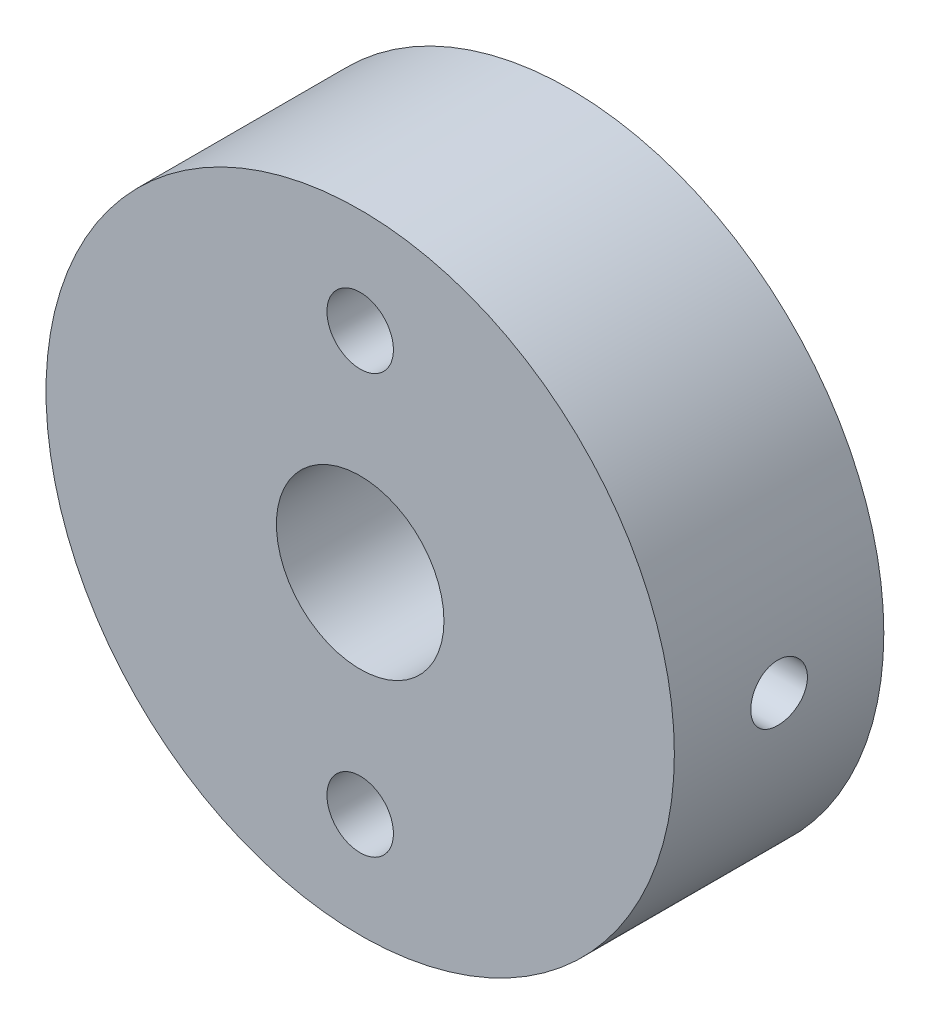
ISO-10303-21;
HEADER;
FILE_DESCRIPTION(('STEP AP214'),'2;1');
FILE_NAME('part.step','',(''),(''),'','','');
FILE_SCHEMA(('AUTOMOTIVE_DESIGN { 1 0 10303 214 1 1 1 1 }'));
ENDSEC;
DATA;
#1=APPLICATION_CONTEXT('core data for automotive mechanical design processes');
#2=APPLICATION_PROTOCOL_DEFINITION('international standard','automotive_design',2000,#1);
#3=PRODUCT_CONTEXT('',#1,'mechanical');
#4=PRODUCT('Part','Part','',(#3));
#5=PRODUCT_RELATED_PRODUCT_CATEGORY('part','',(#4));
#6=PRODUCT_DEFINITION_FORMATION('','',#4);
#7=PRODUCT_DEFINITION_CONTEXT('part definition',#1,'design');
#8=PRODUCT_DEFINITION('design','',#6,#7);
#9=PRODUCT_DEFINITION_SHAPE('','',#8);
#10=(LENGTH_UNIT() NAMED_UNIT(*) SI_UNIT(.MILLI.,.METRE.));
#11=(NAMED_UNIT(*) PLANE_ANGLE_UNIT() SI_UNIT($,.RADIAN.));
#12=(NAMED_UNIT(*) SI_UNIT($,.STERADIAN.) SOLID_ANGLE_UNIT());
#13=UNCERTAINTY_MEASURE_WITH_UNIT(LENGTH_MEASURE(1.E-05),#10,'distance_accuracy_value','');
#14=(GEOMETRIC_REPRESENTATION_CONTEXT(3) GLOBAL_UNCERTAINTY_ASSIGNED_CONTEXT((#13)) GLOBAL_UNIT_ASSIGNED_CONTEXT((#10,
#11,#12)) REPRESENTATION_CONTEXT('',''));
#15=CARTESIAN_POINT('',(0.,0.,0.));
#16=DIRECTION('',(0.,0.,1.));
#17=DIRECTION('',(1.,0.,0.));
#18=AXIS2_PLACEMENT_3D('',#15,#16,#17);
#19=CARTESIAN_POINT('',(0.,0.,10.));
#20=DIRECTION('',(0.,0.,1.));
#21=DIRECTION('',(1.,0.,0.));
#22=AXIS2_PLACEMENT_3D('',#19,#20,#21);
#23=PLANE('',#22);
#24=CARTESIAN_POINT('',(0.,0.,10.));
#25=DIRECTION('',(0.,0.,1.));
#26=DIRECTION('',(1.,0.,0.));
#27=AXIS2_PLACEMENT_3D('',#24,#25,#26);
#28=CIRCLE('',#27,4.);
#29=CARTESIAN_POINT('',(4.,0.,10.));
#30=VERTEX_POINT('',#29);
#31=EDGE_CURVE('E52',#30,#30,#28,.T.);
#32=ORIENTED_EDGE('',*,*,#31,.F.);
#33=EDGE_LOOP('',(#32));
#34=FACE_BOUND('',#33,.T.);
#35=CARTESIAN_POINT('',(0.,0.,10.));
#36=DIRECTION('',(0.,0.,1.));
#37=DIRECTION('',(1.,0.,0.));
#38=AXIS2_PLACEMENT_3D('',#35,#36,#37);
#39=CIRCLE('',#38,15.);
#40=CARTESIAN_POINT('',(15.,0.,10.));
#41=VERTEX_POINT('',#40);
#42=EDGE_CURVE('E10',#41,#41,#39,.T.);
#43=ORIENTED_EDGE('',*,*,#42,.T.);
#44=EDGE_LOOP('',(#43));
#45=FACE_BOUND('',#44,.T.);
#46=CARTESIAN_POINT('',(0.,10.,10.));
#47=DIRECTION('',(0.,0.,1.));
#48=DIRECTION('',(1.,0.,0.));
#49=AXIS2_PLACEMENT_3D('',#46,#47,#48);
#50=CIRCLE('',#49,1.5875);
#51=CARTESIAN_POINT('',(1.5875,10.,10.));
#52=VERTEX_POINT('',#51);
#53=EDGE_CURVE('E47',#52,#52,#50,.T.);
#54=ORIENTED_EDGE('',*,*,#53,.F.);
#55=EDGE_LOOP('',(#54));
#56=FACE_BOUND('',#55,.T.);
#57=CARTESIAN_POINT('',(2.8176792204172E-13,-10.,10.));
#58=DIRECTION('',(0.,0.,1.));
#59=DIRECTION('',(1.,0.,0.));
#60=AXIS2_PLACEMENT_3D('',#57,#58,#59);
#61=CIRCLE('',#60,1.5875);
#62=CARTESIAN_POINT('',(1.58750000000028,-10.,10.));
#63=VERTEX_POINT('',#62);
#64=EDGE_CURVE('E58',#63,#63,#61,.T.);
#65=ORIENTED_EDGE('',*,*,#64,.F.);
#66=EDGE_LOOP('',(#65));
#67=FACE_BOUND('',#66,.T.);
#68=ADVANCED_FACE('F35',(#34,#45,#56,#67),#23,.T.);
#69=CARTESIAN_POINT('',(0.,0.,0.));
#70=DIRECTION('',(0.,0.,1.));
#71=DIRECTION('',(1.,0.,0.));
#72=AXIS2_PLACEMENT_3D('',#69,#70,#71);
#73=PLANE('',#72);
#74=CARTESIAN_POINT('',(0.,0.,0.));
#75=DIRECTION('',(0.,0.,1.));
#76=DIRECTION('',(1.,0.,0.));
#77=AXIS2_PLACEMENT_3D('',#74,#75,#76);
#78=CIRCLE('',#77,4.);
#79=CARTESIAN_POINT('',(4.,0.,0.));
#80=VERTEX_POINT('',#79);
#81=EDGE_CURVE('E55',#80,#80,#78,.T.);
#82=ORIENTED_EDGE('',*,*,#81,.T.);
#83=EDGE_LOOP('',(#82));
#84=FACE_BOUND('',#83,.T.);
#85=CARTESIAN_POINT('',(0.,0.,0.));
#86=DIRECTION('',(0.,0.,1.));
#87=DIRECTION('',(1.,0.,0.));
#88=AXIS2_PLACEMENT_3D('',#85,#86,#87);
#89=CIRCLE('',#88,15.);
#90=CARTESIAN_POINT('',(15.,0.,0.));
#91=VERTEX_POINT('',#90);
#92=EDGE_CURVE('E40',#91,#91,#89,.T.);
#93=ORIENTED_EDGE('',*,*,#92,.F.);
#94=EDGE_LOOP('',(#93));
#95=FACE_BOUND('',#94,.T.);
#96=CARTESIAN_POINT('',(0.,10.,0.));
#97=DIRECTION('',(0.,0.,1.));
#98=DIRECTION('',(1.,0.,0.));
#99=AXIS2_PLACEMENT_3D('',#96,#97,#98);
#100=CIRCLE('',#99,1.5875);
#101=CARTESIAN_POINT('',(1.5875,10.,0.));
#102=VERTEX_POINT('',#101);
#103=EDGE_CURVE('E49',#102,#102,#100,.T.);
#104=ORIENTED_EDGE('',*,*,#103,.T.);
#105=EDGE_LOOP('',(#104));
#106=FACE_BOUND('',#105,.T.);
#107=CARTESIAN_POINT('',(2.8176792204172E-13,-10.,0.));
#108=DIRECTION('',(0.,0.,1.));
#109=DIRECTION('',(1.,0.,0.));
#110=AXIS2_PLACEMENT_3D('',#107,#108,#109);
#111=CIRCLE('',#110,1.5875);
#112=CARTESIAN_POINT('',(1.58750000000028,-10.,0.));
#113=VERTEX_POINT('',#112);
#114=EDGE_CURVE('E61',#113,#113,#111,.T.);
#115=ORIENTED_EDGE('',*,*,#114,.T.);
#116=EDGE_LOOP('',(#115));
#117=FACE_BOUND('',#116,.T.);
#118=ADVANCED_FACE('F96',(#84,#95,#106,#117),#73,.F.);
#119=CARTESIAN_POINT('',(0.,0.,10.));
#120=DIRECTION('',(0.,0.,-1.));
#121=DIRECTION('',(-1.,0.,0.));
#122=AXIS2_PLACEMENT_3D('',#119,#120,#121);
#123=CYLINDRICAL_SURFACE('',#122,15.);
#124=CARTESIAN_POINT('',(15.,0.,3.64744990600001));
#125=CARTESIAN_POINT('',(14.9999992058665,-0.0758081580350931,3.64745320656522));
#126=CARTESIAN_POINT('',(14.9994191935841,-0.151667346377626,3.65384473204097));
#127=CARTESIAN_POINT('',(14.9971611785516,-0.30128520529845,3.6792467544564));
#128=CARTESIAN_POINT('',(14.9954819451863,-0.375041424840312,3.69827139493923));
#129=CARTESIAN_POINT('',(14.9912151695011,-0.518264879092154,3.74838357901847));
#130=CARTESIAN_POINT('',(14.9886281546888,-0.58773457717212,3.77946411809135));
#131=CARTESIAN_POINT('',(14.9828356068879,-0.720455006174018,3.85279288190146));
#132=CARTESIAN_POINT('',(14.9796302026163,-0.78370702716848,3.8950387832591));
#133=CARTESIAN_POINT('',(14.9729497226736,-0.902399694196763,3.98963359026781));
#134=CARTESIAN_POINT('',(14.9694739611822,-0.957819398879537,4.04200872598811));
#135=CARTESIAN_POINT('',(14.9626502282661,-1.05909446005798,4.15531959745669));
#136=CARTESIAN_POINT('',(14.9593022625735,-1.10494938794216,4.21625571663033));
#137=CARTESIAN_POINT('',(14.9531059811379,-1.1858655517647,4.3450874517813));
#138=CARTESIAN_POINT('',(14.9502585318359,-1.22090814820215,4.41299482003091));
#139=CARTESIAN_POINT('',(14.9453938257374,-1.27908587619743,4.55375967357761));
#140=CARTESIAN_POINT('',(14.9433765520164,-1.30222125050697,4.62661705792479));
#141=CARTESIAN_POINT('',(14.9404065602561,-1.33586648196565,4.77500229873164));
#142=CARTESIAN_POINT('',(14.9394509429918,-1.34641072953017,4.85052229843473));
#143=CARTESIAN_POINT('',(14.9387033725099,-1.35468066282716,5.00226576083181));
#144=CARTESIAN_POINT('',(14.9389113940625,-1.35240662648491,5.0784892082379));
#145=CARTESIAN_POINT('',(14.9404649568342,-1.33513293477152,5.22923964893356));
#146=CARTESIAN_POINT('',(14.9418071510828,-1.32017072205085,5.30377097190119));
#147=CARTESIAN_POINT('',(14.9454725874951,-1.2780036055167,5.44926016320109));
#148=CARTESIAN_POINT('',(14.9477958406719,-1.25079856426956,5.52021799140864));
#149=CARTESIAN_POINT('',(14.9531654766319,-1.18487634987832,5.65666487981866));
#150=CARTESIAN_POINT('',(14.9562129087597,-1.14614245051006,5.72214581603185));
#151=CARTESIAN_POINT('',(14.9626865995185,-1.05827407509715,5.8456912935356));
#152=CARTESIAN_POINT('',(14.9661128671487,-1.00913935195625,5.90375565857535));
#153=CARTESIAN_POINT('',(14.9729730766611,-0.901654419402946,6.0110374179021));
#154=CARTESIAN_POINT('',(14.9764070021142,-0.843271853237719,6.06022240103862));
#155=CARTESIAN_POINT('',(14.982883969099,-0.71906117938359,6.14809838065316));
#156=CARTESIAN_POINT('',(14.985927010307,-0.653233065528459,6.18678936844021));
#157=CARTESIAN_POINT('',(14.9912800771272,-0.515978307885073,6.25257732337302));
#158=CARTESIAN_POINT('',(14.9935900068424,-0.44455093319138,6.27967277389128));
#159=CARTESIAN_POINT('',(14.9972155383322,-0.29813524039691,6.32147741007426));
#160=CARTESIAN_POINT('',(14.9985311642719,-0.223147008885091,6.33618689676432));
#161=CARTESIAN_POINT('',(15.0000167515703,-0.0720190787729175,6.35276123399728));
#162=CARTESIAN_POINT('',(15.0001907044379,0.00411567433265238,6.35467083590254));
#163=CARTESIAN_POINT('',(14.9993840229679,0.155622157180234,6.34570854852532));
#164=CARTESIAN_POINT('',(14.9984034012697,0.230993895266114,6.33483679916454));
#165=CARTESIAN_POINT('',(14.9954003804241,0.378706612533805,6.3006575235702));
#166=CARTESIAN_POINT('',(14.9933797260214,0.451052448838974,6.27737082215504));
#167=CARTESIAN_POINT('',(14.988523512928,0.590810388433427,6.2190439870601));
#168=CARTESIAN_POINT('',(14.985687939239,0.658222400887899,6.18400363705452));
#169=CARTESIAN_POINT('',(14.9795095348584,0.786402257087437,6.10305228504276));
#170=CARTESIAN_POINT('',(14.9761653342114,0.847151370315507,6.05711173099408));
#171=CARTESIAN_POINT('',(14.9693497300832,0.960091706233924,5.95570662033652));
#172=CARTESIAN_POINT('',(14.9658783240137,1.01228275468397,5.90024186986417));
#173=CARTESIAN_POINT('',(14.9591876648378,1.10677968445096,5.78116819449133));
#174=CARTESIAN_POINT('',(14.9559691765143,1.14905629731429,5.71753599316432));
#175=CARTESIAN_POINT('',(14.9501599339076,1.22232339334472,5.58404914939775));
#176=CARTESIAN_POINT('',(14.9475691724464,1.25331400557059,5.51419457812421));
#177=CARTESIAN_POINT('',(14.9433132226975,1.30307986628873,5.37034827666375));
#178=CARTESIAN_POINT('',(14.9416466921495,1.3218728362121,5.29636271882573));
#179=CARTESIAN_POINT('',(14.9394235427809,1.34676757146813,5.14627055836846));
#180=CARTESIAN_POINT('',(14.9388668985823,1.35286962698579,5.07016400428733));
#181=CARTESIAN_POINT('',(14.9389269863503,1.35220570872011,4.91828111268282));
#182=CARTESIAN_POINT('',(14.9395395254148,1.34548571714396,4.84250456827683));
#183=CARTESIAN_POINT('',(14.9418600417013,1.31946454860505,4.69316121408006));
#184=CARTESIAN_POINT('',(14.9435680204383,1.30016335424364,4.61959440734528));
#185=CARTESIAN_POINT('',(14.9478858444146,1.24953973556081,4.47675715237553));
#186=CARTESIAN_POINT('',(14.9504956118149,1.21821834875196,4.40748633393526));
#187=CARTESIAN_POINT('',(14.9563231062548,1.14444840170881,4.27517835127851));
#188=CARTESIAN_POINT('',(14.9595408261471,1.10199997228702,4.21214111379036));
#189=CARTESIAN_POINT('',(14.9662354429999,1.00700801061017,4.09385415067731));
#190=CARTESIAN_POINT('',(14.9697131918964,0.954430317861148,4.03863190609529));
#191=CARTESIAN_POINT('',(14.9765282124078,0.840737014700298,3.93777203270307));
#192=CARTESIAN_POINT('',(14.9798654499668,0.7796193497791,3.89213671690792));
#193=CARTESIAN_POINT('',(14.986030485119,0.650443870388163,3.81167381028577));
#194=CARTESIAN_POINT('',(14.9888571914165,0.582371664910512,3.77686925885965));
#195=CARTESIAN_POINT('',(14.9936702974211,0.44136923458162,3.71922947632665));
#196=CARTESIAN_POINT('',(14.9956576553888,0.368444660297001,3.69638058860965));
#197=CARTESIAN_POINT('',(14.9980621495304,0.245913751058619,3.66907275107043));
#198=CARTESIAN_POINT('',(14.9987855041192,0.197093662118762,3.66097507805234));
#199=CARTESIAN_POINT('',(14.9997546875403,0.0988562821065964,3.6501625878879));
#200=CARTESIAN_POINT('',(15.0000005179015,0.0494389929470205,3.64744775350581));
#201=CARTESIAN_POINT('',(15.,0.,3.64744990600001));
#202=B_SPLINE_CURVE_WITH_KNOTS('',3,(#124,#125,#126,#127,#128,#129,#130,#131,#132,#133,#134,
#135,#136,#137,#138,#139,#140,#141,#142,#143,#144,#145,#146,#147,#148,#149,#150,#151,#152,#153,
#154,#155,#156,#157,#158,#159,#160,#161,#162,#163,#164,#165,#166,#167,#168,#169,#170,#171,#172,
#173,#174,#175,#176,#177,#178,#179,#180,#181,#182,#183,#184,#185,#186,#187,#188,#189,#190,#191,
#192,#193,#194,#195,#196,#197,#198,#199,#200,#201),.UNSPECIFIED.,.T.,.F.,(4,2,2,2,2,2,2,2,2,2,2,
2,2,2,2,2,2,2,2,2,2,2,2,2,2,2,2,2,2,2,2,2,2,2,2,2,2,2,4),(0.,0.22724395762551,0.454742758634511,
0.68210957946888,0.909429125161569,1.13734540268933,1.36527189128214,1.59358913746592,
1.82190172877776,2.04958928813136,2.2772719107954,2.50428497363473,2.73130058490595,
2.95864717237611,3.18599916161015,3.41416494380003,3.64233091495288,3.87052671974744,
4.09871697836884,4.32610901295139,4.55349855822086,4.78050787523338,5.00752137058006,
5.23515751057122,5.4627982846084,5.69110284848253,5.919404801544,6.14737431759619,
6.37533862093811,6.60248693884002,6.82963557086786,7.0567646011646,7.28389096139102,
7.51179714560285,7.73975825319662,7.96820102037277,8.19638227115084,8.3445819990298,
8.49278125237532),.UNSPECIFIED.);
#203=CARTESIAN_POINT('',(15.,0.,3.64744990600001));
#204=VERTEX_POINT('',#203);
#205=EDGE_CURVE('E64',#204,#204,#202,.T.);
#206=ORIENTED_EDGE('',*,*,#205,.T.);
#207=EDGE_LOOP('',(#206));
#208=FACE_BOUND('',#207,.T.);
#209=ORIENTED_EDGE('',*,*,#42,.F.);
#210=EDGE_LOOP('',(#209));
#211=FACE_BOUND('',#210,.T.);
#212=ORIENTED_EDGE('',*,*,#92,.T.);
#213=EDGE_LOOP('',(#212));
#214=FACE_BOUND('',#213,.T.);
#215=ADVANCED_FACE('F37',(#208,#211,#214),#123,.T.);
#216=CARTESIAN_POINT('',(0.,10.,10.));
#217=DIRECTION('',(0.,0.,-1.));
#218=DIRECTION('',(-1.,0.,0.));
#219=AXIS2_PLACEMENT_3D('',#216,#217,#218);
#220=CYLINDRICAL_SURFACE('',#219,1.5875);
#221=ORIENTED_EDGE('',*,*,#53,.T.);
#222=EDGE_LOOP('',(#221));
#223=FACE_BOUND('',#222,.T.);
#224=ORIENTED_EDGE('',*,*,#103,.F.);
#225=EDGE_LOOP('',(#224));
#226=FACE_BOUND('',#225,.T.);
#227=ADVANCED_FACE('F90',(#223,#226),#220,.F.);
#228=CARTESIAN_POINT('',(0.,0.,10.));
#229=DIRECTION('',(0.,0.,-1.));
#230=DIRECTION('',(-1.,0.,0.));
#231=AXIS2_PLACEMENT_3D('',#228,#229,#230);
#232=CYLINDRICAL_SURFACE('',#231,4.);
#233=CARTESIAN_POINT('',(4.,0.,3.64744990600001));
#234=CARTESIAN_POINT('',(4.0000003652744,-0.0737390509618185,3.64744934594));
#235=CARTESIAN_POINT('',(3.9979422676283,-0.147474310927838,3.6534996681396));
#236=CARTESIAN_POINT('',(3.98993514213324,-0.292769357385459,3.67746445232306));
#237=CARTESIAN_POINT('',(3.98398582152813,-0.364328979769023,3.69537980697392));
#238=CARTESIAN_POINT('',(3.96884184238156,-0.503157126306702,3.74238779972289));
#239=CARTESIAN_POINT('',(3.95965270522232,-0.570432722546803,3.77146142900934));
#240=CARTESIAN_POINT('',(3.93896448953899,-0.699152411861926,3.83987356813319));
#241=CARTESIAN_POINT('',(3.92746493502911,-0.760595299451358,3.87921419364883));
#242=CARTESIAN_POINT('',(3.90290684204576,-0.878087591662698,3.96851012490239));
#243=CARTESIAN_POINT('',(3.88981017965103,-0.933901351542575,4.01876493346578));
#244=CARTESIAN_POINT('',(3.86374115173317,-1.03648991777588,4.127826057846));
#245=CARTESIAN_POINT('',(3.85076881530033,-1.08326265549071,4.18663432536275));
#246=CARTESIAN_POINT('',(3.82599515792021,-1.16780306583327,4.31327416986333));
#247=CARTESIAN_POINT('',(3.81424014143166,-1.20526152944493,4.38132209984905));
#248=CARTESIAN_POINT('',(3.793813224202,-1.2681013612762,4.52321341614728));
#249=CARTESIAN_POINT('',(3.78514035154269,-1.29348653752227,4.59705496652644));
#250=CARTESIAN_POINT('',(3.77226179997908,-1.33057003933591,4.74575355187506));
#251=CARTESIAN_POINT('',(3.76791214685452,-1.34271089853046,4.82048737993321));
#252=CARTESIAN_POINT('',(3.76374712025534,-1.35434465925974,4.97104821284548));
#253=CARTESIAN_POINT('',(3.76393029707729,-1.35384160460854,5.04687486043691));
#254=CARTESIAN_POINT('',(3.76868428428414,-1.34054483005336,5.1936661448558));
#255=CARTESIAN_POINT('',(3.77304757543275,-1.32833239185101,5.26469133121487));
#256=CARTESIAN_POINT('',(3.78533000773349,-1.29291317512871,5.40361805577399));
#257=CARTESIAN_POINT('',(3.79324958622069,-1.26970504439218,5.47151920866291));
#258=CARTESIAN_POINT('',(3.81189752199324,-1.2125796956735,5.60357590621904));
#259=CARTESIAN_POINT('',(3.82266992332552,-1.17849266093029,5.66765150201615));
#260=CARTESIAN_POINT('',(3.84579168954526,-1.10069502115956,5.78935535242058));
#261=CARTESIAN_POINT('',(3.85814151999593,-1.05698157221814,5.8469816941329));
#262=CARTESIAN_POINT('',(3.88383915451425,-0.958394767498533,5.95741250616814));
#263=CARTESIAN_POINT('',(3.89720489555063,-0.903047375464346,6.00979049191026));
#264=CARTESIAN_POINT('',(3.92284799554659,-0.784190835217095,6.10463435552345));
#265=CARTESIAN_POINT('',(3.9351252438892,-0.72068085909259,6.14709922669877));
#266=CARTESIAN_POINT('',(3.95737745603798,-0.5863774780034,6.22126818636138));
#267=CARTESIAN_POINT('',(3.96732697545626,-0.515514792387583,6.2528549834314));
#268=CARTESIAN_POINT('',(3.98361761388867,-0.369064286005888,6.30352622964287));
#269=CARTESIAN_POINT('',(3.9899600242462,-0.293478166996248,6.32261515338777));
#270=CARTESIAN_POINT('',(3.99810645778428,-0.143334606318405,6.34698621321967));
#271=CARTESIAN_POINT('',(4.00009970292712,-0.0688808146920521,6.35284441211286));
#272=CARTESIAN_POINT('',(3.99989262166952,0.0799626683313198,6.35223270068089));
#273=CARTESIAN_POINT('',(3.9976930264654,0.154352368641953,6.34576493990015));
#274=CARTESIAN_POINT('',(3.98947237211125,0.298630325753245,6.32113896813257));
#275=CARTESIAN_POINT('',(3.98356782182736,0.368586673962149,6.30333694124283));
#276=CARTESIAN_POINT('',(3.96864809967418,0.504489462163016,6.25699567550484));
#277=CARTESIAN_POINT('',(3.95963252908952,0.570435386895211,6.22845506033258));
#278=CARTESIAN_POINT('',(3.93910368260848,0.698410294101009,6.16060321500829));
#279=CARTESIAN_POINT('',(3.92753011320834,0.760287564381751,6.12102460954258));
#280=CARTESIAN_POINT('',(3.9031943071523,0.876708176692177,6.03253294622906));
#281=CARTESIAN_POINT('',(3.89043169887101,0.931249212732043,5.98361696500876));
#282=CARTESIAN_POINT('',(3.86439742013857,1.03410865095364,5.87513135897271));
#283=CARTESIAN_POINT('',(3.85112989689448,1.08201607624762,5.81517012071804));
#284=CARTESIAN_POINT('',(3.82619275797566,1.1671430673832,5.68777651555582));
#285=CARTESIAN_POINT('',(3.81452316678755,1.20436246945168,5.62034403418796));
#286=CARTESIAN_POINT('',(3.79421204563183,1.26690207526012,5.47984557113209));
#287=CARTESIAN_POINT('',(3.78556601315449,1.29223999157417,5.40678816543756));
#288=CARTESIAN_POINT('',(3.77242033377096,1.33013343190278,5.25708184733402));
#289=CARTESIAN_POINT('',(3.76791874676199,1.34269493711504,5.18043463306748));
#290=CARTESIAN_POINT('',(3.76379652207792,1.35420428715988,5.03008137251586));
#291=CARTESIAN_POINT('',(3.76393060026203,1.35383624769368,4.95643385281679));
#292=CARTESIAN_POINT('',(3.76845566270461,1.34118827642512,4.81030896679298));
#293=CARTESIAN_POINT('',(3.7728463793485,1.32890909347553,4.73783152719661));
#294=CARTESIAN_POINT('',(3.78520481653253,1.29327749830683,4.59755898842039));
#295=CARTESIAN_POINT('',(3.7930987880036,1.27015285741645,4.52969901936869));
#296=CARTESIAN_POINT('',(3.81154517911969,1.21367284791613,4.39877110251214));
#297=CARTESIAN_POINT('',(3.82209819936226,1.18031516760581,4.33570424151788));
#298=CARTESIAN_POINT('',(3.84526124892901,1.10257812997164,4.21309804372924));
#299=CARTESIAN_POINT('',(3.85794211029656,1.0577729746199,4.15384215060042));
#300=CARTESIAN_POINT('',(3.8836416590064,0.959125818306252,4.04346931603738));
#301=CARTESIAN_POINT('',(3.89666044224806,0.905281227791765,3.99235471506245));
#302=CARTESIAN_POINT('',(3.92220271600919,0.787463330671119,3.89762360596853));
#303=CARTESIAN_POINT('',(3.93468472207405,0.723167865506795,3.85439514471458));
#304=CARTESIAN_POINT('',(3.95716814430872,0.587808236572523,3.77940356184837));
#305=CARTESIAN_POINT('',(3.96717010956017,0.516745575892184,3.74763790165874));
#306=CARTESIAN_POINT('',(3.98326295233837,0.372423161492993,3.69757180628126));
#307=CARTESIAN_POINT('',(3.98947881260907,0.299328134068115,3.67883778597342));
#308=CARTESIAN_POINT('',(3.99784654720756,0.150820286948907,3.65377896180266));
#309=CARTESIAN_POINT('',(3.99999962645748,0.0754081611948086,3.64745047873717));
#310=CARTESIAN_POINT('',(4.,0.,3.64744990600001));
#311=B_SPLINE_CURVE_WITH_KNOTS('',3,(#233,#234,#235,#236,#237,#238,#239,#240,#241,#242,#243,
#244,#245,#246,#247,#248,#249,#250,#251,#252,#253,#254,#255,#256,#257,#258,#259,#260,#261,#262,
#263,#264,#265,#266,#267,#268,#269,#270,#271,#272,#273,#274,#275,#276,#277,#278,#279,#280,#281,
#282,#283,#284,#285,#286,#287,#288,#289,#290,#291,#292,#293,#294,#295,#296,#297,#298,#299,#300,
#301,#302,#303,#304,#305,#306,#307,#308,#309,#310),.UNSPECIFIED.,.T.,.F.,(4,2,2,2,2,2,2,2,2,2,2,
2,2,2,2,2,2,2,2,2,2,2,2,2,2,2,2,2,2,2,2,2,2,2,2,2,2,2,4),(0.,0.220939581068785,
0.441895786439387,0.662477238152887,0.883104180130911,1.11079439594426,1.33853664709934,
1.57305252102399,1.80749437733888,2.03383714603689,2.26010752603994,2.47569718163393,
2.69131335666791,2.91047495342985,3.12970138376854,3.36072760342571,3.59177727404101,
3.82524545926202,4.058630010282,4.28163932601376,4.50460975434197,4.72089753822001,
4.93721305232835,5.15930761136237,5.38147181878623,5.61403918754246,5.84661011975027,
6.07883323098321,6.31094757829824,6.53079998026519,6.7506385610225,6.96605385334919,
7.18151784506629,7.4066072008356,7.63176114896825,7.86604414860135,8.10027523151229,
8.32628289926542,8.55222352809417),.UNSPECIFIED.);
#312=CARTESIAN_POINT('',(4.,0.,3.64744990600001));
#313=VERTEX_POINT('',#312);
#314=EDGE_CURVE('E72',#313,#313,#311,.T.);
#315=ORIENTED_EDGE('',*,*,#314,.F.);
#316=EDGE_LOOP('',(#315));
#317=FACE_BOUND('',#316,.T.);
#318=ORIENTED_EDGE('',*,*,#31,.T.);
#319=EDGE_LOOP('',(#318));
#320=FACE_BOUND('',#319,.T.);
#321=ORIENTED_EDGE('',*,*,#81,.F.);
#322=EDGE_LOOP('',(#321));
#323=FACE_BOUND('',#322,.T.);
#324=ADVANCED_FACE('F86',(#317,#320,#323),#232,.F.);
#325=CARTESIAN_POINT('',(2.8176792204172E-13,-10.,10.));
#326=DIRECTION('',(0.,0.,-1.));
#327=DIRECTION('',(-1.,0.,0.));
#328=AXIS2_PLACEMENT_3D('',#325,#326,#327);
#329=CYLINDRICAL_SURFACE('',#328,1.5875);
#330=ORIENTED_EDGE('',*,*,#64,.T.);
#331=EDGE_LOOP('',(#330));
#332=FACE_BOUND('',#331,.T.);
#333=ORIENTED_EDGE('',*,*,#114,.F.);
#334=EDGE_LOOP('',(#333));
#335=FACE_BOUND('',#334,.T.);
#336=ADVANCED_FACE('F79',(#332,#335),#329,.F.);
#337=CARTESIAN_POINT('',(15.,0.,4.999999906));
#338=DIRECTION('',(1.,0.,0.));
#339=DIRECTION('',(0.,0.,-1.));
#340=AXIS2_PLACEMENT_3D('',#337,#338,#339);
#341=CYLINDRICAL_SURFACE('',#340,1.35254999999999);
#342=ORIENTED_EDGE('',*,*,#314,.T.);
#343=EDGE_LOOP('',(#342));
#344=FACE_BOUND('',#343,.T.);
#345=ORIENTED_EDGE('',*,*,#205,.F.);
#346=EDGE_LOOP('',(#345));
#347=FACE_BOUND('',#346,.T.);
#348=ADVANCED_FACE('F76',(#344,#347),#341,.F.);
#349=CLOSED_SHELL('',(#68,#118,#215,#227,#324,#336,#348));
#350=MANIFOLD_SOLID_BREP('B2',#349);
#351=ADVANCED_BREP_SHAPE_REPRESENTATION('',(#18,#350),#14);
#352=SHAPE_DEFINITION_REPRESENTATION(#9,#351);
ENDSEC;
END-ISO-10303-21;
